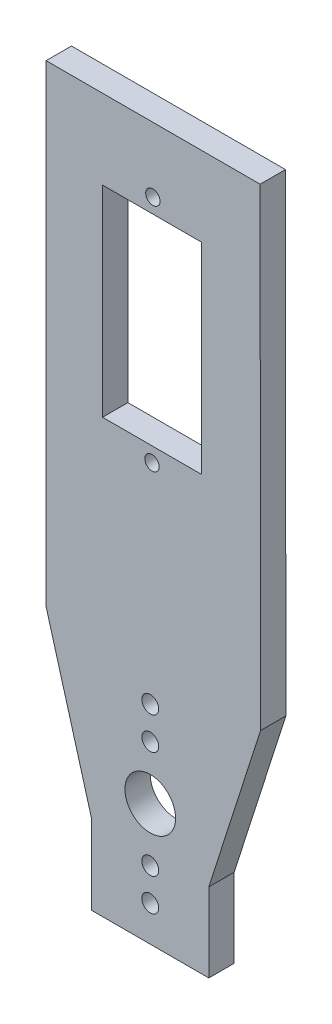
ISO-10303-21;
HEADER;
FILE_DESCRIPTION(('STEP AP214'),'2;1');
FILE_NAME('part.step','',(''),(''),'','','');
FILE_SCHEMA(('AUTOMOTIVE_DESIGN { 1 0 10303 214 1 1 1 1 }'));
ENDSEC;
DATA;
#1=APPLICATION_CONTEXT('core data for automotive mechanical design processes');
#2=APPLICATION_PROTOCOL_DEFINITION('international standard','automotive_design',2000,#1);
#3=PRODUCT_CONTEXT('',#1,'mechanical');
#4=PRODUCT('Part','Part','',(#3));
#5=PRODUCT_RELATED_PRODUCT_CATEGORY('part','',(#4));
#6=PRODUCT_DEFINITION_FORMATION('','',#4);
#7=PRODUCT_DEFINITION_CONTEXT('part definition',#1,'design');
#8=PRODUCT_DEFINITION('design','',#6,#7);
#9=PRODUCT_DEFINITION_SHAPE('','',#8);
#10=(LENGTH_UNIT() NAMED_UNIT(*) SI_UNIT(.MILLI.,.METRE.));
#11=(NAMED_UNIT(*) PLANE_ANGLE_UNIT() SI_UNIT($,.RADIAN.));
#12=(NAMED_UNIT(*) SI_UNIT($,.STERADIAN.) SOLID_ANGLE_UNIT());
#13=UNCERTAINTY_MEASURE_WITH_UNIT(LENGTH_MEASURE(1.E-05),#10,'distance_accuracy_value','');
#14=(GEOMETRIC_REPRESENTATION_CONTEXT(3) GLOBAL_UNCERTAINTY_ASSIGNED_CONTEXT((#13)) GLOBAL_UNIT_ASSIGNED_CONTEXT((#10,
#11,#12)) REPRESENTATION_CONTEXT('',''));
#15=CARTESIAN_POINT('',(0.,0.,0.));
#16=DIRECTION('',(0.,0.,1.));
#17=DIRECTION('',(1.,0.,0.));
#18=AXIS2_PLACEMENT_3D('',#15,#16,#17);
#19=CARTESIAN_POINT('',(0.,0.,3.));
#20=DIRECTION('',(0.,0.,1.));
#21=DIRECTION('',(1.,0.,0.));
#22=AXIS2_PLACEMENT_3D('',#19,#20,#21);
#23=PLANE('',#22);
#24=CARTESIAN_POINT('',(-356.8563,191.755994220096,3.));
#25=DIRECTION('',(0.,0.,1.));
#26=DIRECTION('',(1.,0.,0.));
#27=AXIS2_PLACEMENT_3D('',#24,#25,#26);
#28=CIRCLE('',#27,1.00090000000003);
#29=CARTESIAN_POINT('',(-355.8554,191.755994220096,3.));
#30=VERTEX_POINT('',#29);
#31=EDGE_CURVE('E336',#30,#30,#28,.T.);
#32=ORIENTED_EDGE('',*,*,#31,.F.);
#33=EDGE_LOOP('',(#32));
#34=FACE_BOUND('',#33,.T.);
#35=CARTESIAN_POINT('',(-356.8563,187.905994220096,3.));
#36=DIRECTION('',(0.,0.,1.));
#37=DIRECTION('',(1.,0.,0.));
#38=AXIS2_PLACEMENT_3D('',#35,#36,#37);
#39=CIRCLE('',#38,1.00090000000003);
#40=CARTESIAN_POINT('',(-355.8554,187.905994220096,3.));
#41=VERTEX_POINT('',#40);
#42=EDGE_CURVE('E338',#41,#41,#39,.T.);
#43=ORIENTED_EDGE('',*,*,#42,.F.);
#44=EDGE_LOOP('',(#43));
#45=FACE_BOUND('',#44,.T.);
#46=CARTESIAN_POINT('',(-356.8563,175.205994220096,3.));
#47=DIRECTION('',(0.,0.,1.));
#48=DIRECTION('',(1.,0.,0.));
#49=AXIS2_PLACEMENT_3D('',#46,#47,#48);
#50=CIRCLE('',#49,1.00090000000003);
#51=CARTESIAN_POINT('',(-355.8554,175.205994220096,3.));
#52=VERTEX_POINT('',#51);
#53=EDGE_CURVE('E344',#52,#52,#50,.T.);
#54=ORIENTED_EDGE('',*,*,#53,.F.);
#55=EDGE_LOOP('',(#54));
#56=FACE_BOUND('',#55,.T.);
#57=CARTESIAN_POINT('',(-356.8563,171.355994220096,3.));
#58=DIRECTION('',(0.,0.,1.));
#59=DIRECTION('',(1.,0.,0.));
#60=AXIS2_PLACEMENT_3D('',#57,#58,#59);
#61=CIRCLE('',#60,1.00090000000003);
#62=CARTESIAN_POINT('',(-355.8554,171.355994220096,3.));
#63=VERTEX_POINT('',#62);
#64=EDGE_CURVE('E350',#63,#63,#61,.T.);
#65=ORIENTED_EDGE('',*,*,#64,.F.);
#66=EDGE_LOOP('',(#65));
#67=FACE_BOUND('',#66,.T.);
#68=CARTESIAN_POINT('',(-356.653301566627,216.604309820037,3.));
#69=DIRECTION('',(0.,0.,1.));
#70=DIRECTION('',(1.,0.,0.));
#71=AXIS2_PLACEMENT_3D('',#68,#69,#70);
#72=CIRCLE('',#71,0.850000000000038);
#73=CARTESIAN_POINT('',(-355.803301566627,216.604309820037,3.));
#74=VERTEX_POINT('',#73);
#75=EDGE_CURVE('E151',#74,#74,#72,.T.);
#76=ORIENTED_EDGE('',*,*,#75,.F.);
#77=EDGE_LOOP('',(#76));
#78=FACE_BOUND('',#77,.T.);
#79=CARTESIAN_POINT('',(-356.8563,181.555994220096,3.));
#80=DIRECTION('',(0.,0.,1.));
#81=DIRECTION('',(1.,0.,0.));
#82=AXIS2_PLACEMENT_3D('',#79,#80,#81);
#83=CIRCLE('',#82,2.99999999999999);
#84=CARTESIAN_POINT('',(-353.8563,181.555994220096,3.));
#85=VERTEX_POINT('',#84);
#86=EDGE_CURVE('E161',#85,#85,#83,.T.);
#87=ORIENTED_EDGE('',*,*,#86,.F.);
#88=EDGE_LOOP('',(#87));
#89=FACE_BOUND('',#88,.T.);
#90=DIRECTION('',(0.,-1.,0.));
#91=VECTOR('',#90,1.);
#92=CARTESIAN_POINT('',(-363.784573437846,176.492478394456,3.));
#93=LINE('',#92,#91);
#94=CARTESIAN_POINT('',(-363.784573437846,176.492478394456,3.));
#95=VERTEX_POINT('',#94);
#96=CARTESIAN_POINT('',(-363.784573437846,167.153932289193,3.));
#97=VERTEX_POINT('',#96);
#98=EDGE_CURVE('E167',#95,#97,#93,.T.);
#99=ORIENTED_EDGE('',*,*,#98,.T.);
#100=DIRECTION('',(1.,0.,0.));
#101=VECTOR('',#100,1.);
#102=CARTESIAN_POINT('',(-363.784573437846,167.153932289193,3.));
#103=LINE('',#102,#101);
#104=CARTESIAN_POINT('',(-349.928026562154,167.153932289193,3.));
#105=VERTEX_POINT('',#104);
#106=EDGE_CURVE('E170',#97,#105,#103,.T.);
#107=ORIENTED_EDGE('',*,*,#106,.T.);
#108=DIRECTION('',(0.,1.,0.));
#109=VECTOR('',#108,1.);
#110=CARTESIAN_POINT('',(-349.928026562154,176.492478394456,3.));
#111=LINE('',#110,#109);
#112=CARTESIAN_POINT('',(-349.928026562154,176.492478394456,3.));
#113=VERTEX_POINT('',#112);
#114=EDGE_CURVE('E173',#105,#113,#111,.T.);
#115=ORIENTED_EDGE('',*,*,#114,.T.);
#116=DIRECTION('',(0.305443848239875,0.952210090039176,0.));
#117=VECTOR('',#116,1.);
#118=CARTESIAN_POINT('',(-343.806464443043,195.57622570254,3.));
#119=LINE('',#118,#117);
#120=CARTESIAN_POINT('',(-343.806464443043,195.57622570254,3.));
#121=VERTEX_POINT('',#120);
#122=EDGE_CURVE('E175',#113,#121,#119,.T.);
#123=ORIENTED_EDGE('',*,*,#122,.T.);
#124=DIRECTION('',(-0.000844338589061444,0.99999964354611,0.));
#125=VECTOR('',#124,1.);
#126=CARTESIAN_POINT('',(-343.853730338658,251.555994220096,3.));
#127=LINE('',#126,#125);
#128=CARTESIAN_POINT('',(-343.853730338658,251.555994220096,3.));
#129=VERTEX_POINT('',#128);
#130=EDGE_CURVE('E177',#121,#129,#127,.T.);
#131=ORIENTED_EDGE('',*,*,#130,.T.);
#132=DIRECTION('',(-1.,0.,0.));
#133=VECTOR('',#132,1.);
#134=CARTESIAN_POINT('',(-369.180567886487,251.555994220096,3.));
#135=LINE('',#134,#133);
#136=CARTESIAN_POINT('',(-369.180567886487,251.555994220096,3.));
#137=VERTEX_POINT('',#136);
#138=EDGE_CURVE('E179',#129,#137,#135,.T.);
#139=ORIENTED_EDGE('',*,*,#138,.T.);
#140=DIRECTION('',(0.,-1.,0.));
#141=VECTOR('',#140,1.);
#142=CARTESIAN_POINT('',(-369.180567886487,195.57622570254,3.));
#143=LINE('',#142,#141);
#144=CARTESIAN_POINT('',(-369.180567886487,195.57622570254,3.));
#145=VERTEX_POINT('',#144);
#146=EDGE_CURVE('E181',#137,#145,#143,.T.);
#147=ORIENTED_EDGE('',*,*,#146,.T.);
#148=DIRECTION('',(0.272085949798576,-0.962272952920431,0.));
#149=VECTOR('',#148,1.);
#150=CARTESIAN_POINT('',(-363.784573437846,176.492478394456,3.));
#151=LINE('',#150,#149);
#152=EDGE_CURVE('E183',#145,#95,#151,.T.);
#153=ORIENTED_EDGE('',*,*,#152,.T.);
#154=EDGE_LOOP('',(#99,#107,#115,#123,#131,#139,#147,#153));
#155=FACE_BOUND('',#154,.T.);
#156=DIRECTION('',(1.,0.,0.));
#157=VECTOR('',#156,1.);
#158=CARTESIAN_POINT('',(-362.501230889206,218.342409820037,3.));
#159=LINE('',#158,#157);
#160=CARTESIAN_POINT('',(-362.501230889206,218.342409820037,3.));
#161=VERTEX_POINT('',#160);
#162=CARTESIAN_POINT('',(-350.791830889206,218.342409820037,3.));
#163=VERTEX_POINT('',#162);
#164=EDGE_CURVE('E130',#161,#163,#159,.T.);
#165=ORIENTED_EDGE('',*,*,#164,.F.);
#166=DIRECTION('',(0.,-1.,0.));
#167=VECTOR('',#166,1.);
#168=CARTESIAN_POINT('',(-362.501230889206,242.142209820037,3.));
#169=LINE('',#168,#167);
#170=CARTESIAN_POINT('',(-362.501230889206,242.142209820037,3.));
#171=VERTEX_POINT('',#170);
#172=EDGE_CURVE('E122',#171,#161,#169,.T.);
#173=ORIENTED_EDGE('',*,*,#172,.F.);
#174=DIRECTION('',(-1.,0.,0.));
#175=VECTOR('',#174,1.);
#176=CARTESIAN_POINT('',(-362.501230889206,242.142209820037,3.));
#177=LINE('',#176,#175);
#178=CARTESIAN_POINT('',(-350.791830889206,242.142209820037,3.));
#179=VERTEX_POINT('',#178);
#180=EDGE_CURVE('E145',#179,#171,#177,.T.);
#181=ORIENTED_EDGE('',*,*,#180,.F.);
#182=DIRECTION('',(0.,1.,0.));
#183=VECTOR('',#182,1.);
#184=CARTESIAN_POINT('',(-350.791830889206,242.142209820037,3.));
#185=LINE('',#184,#183);
#186=EDGE_CURVE('E143',#163,#179,#185,.T.);
#187=ORIENTED_EDGE('',*,*,#186,.F.);
#188=EDGE_LOOP('',(#165,#173,#181,#187));
#189=FACE_BOUND('',#188,.T.);
#190=CARTESIAN_POINT('',(-356.547049338715,243.880309820037,3.));
#191=DIRECTION('',(0.,0.,1.));
#192=DIRECTION('',(1.,0.,0.));
#193=AXIS2_PLACEMENT_3D('',#190,#191,#192);
#194=CIRCLE('',#193,0.850000000000038);
#195=CARTESIAN_POINT('',(-355.697049338715,243.880309820037,3.));
#196=VERTEX_POINT('',#195);
#197=EDGE_CURVE('E359',#196,#196,#194,.T.);
#198=ORIENTED_EDGE('',*,*,#197,.F.);
#199=EDGE_LOOP('',(#198));
#200=FACE_BOUND('',#199,.T.);
#201=ADVANCED_FACE('F33',(#34,#45,#56,#67,#78,#89,#155,#189,#200),#23,.T.);
#202=CARTESIAN_POINT('',(0.,0.,0.));
#203=DIRECTION('',(0.,0.,1.));
#204=DIRECTION('',(1.,0.,0.));
#205=AXIS2_PLACEMENT_3D('',#202,#203,#204);
#206=PLANE('',#205);
#207=CARTESIAN_POINT('',(-356.8563,191.755994220096,0.));
#208=DIRECTION('',(0.,0.,1.));
#209=DIRECTION('',(1.,0.,0.));
#210=AXIS2_PLACEMENT_3D('',#207,#208,#209);
#211=CIRCLE('',#210,1.00090000000003);
#212=CARTESIAN_POINT('',(-355.8554,191.755994220096,0.));
#213=VERTEX_POINT('',#212);
#214=EDGE_CURVE('E334',#213,#213,#211,.T.);
#215=ORIENTED_EDGE('',*,*,#214,.T.);
#216=EDGE_LOOP('',(#215));
#217=FACE_BOUND('',#216,.T.);
#218=CARTESIAN_POINT('',(-356.8563,187.905994220096,0.));
#219=DIRECTION('',(0.,0.,1.));
#220=DIRECTION('',(1.,0.,0.));
#221=AXIS2_PLACEMENT_3D('',#218,#219,#220);
#222=CIRCLE('',#221,1.00090000000003);
#223=CARTESIAN_POINT('',(-355.8554,187.905994220096,0.));
#224=VERTEX_POINT('',#223);
#225=EDGE_CURVE('E341',#224,#224,#222,.T.);
#226=ORIENTED_EDGE('',*,*,#225,.T.);
#227=EDGE_LOOP('',(#226));
#228=FACE_BOUND('',#227,.T.);
#229=CARTESIAN_POINT('',(-356.8563,175.205994220096,0.));
#230=DIRECTION('',(0.,0.,1.));
#231=DIRECTION('',(1.,0.,0.));
#232=AXIS2_PLACEMENT_3D('',#229,#230,#231);
#233=CIRCLE('',#232,1.00090000000003);
#234=CARTESIAN_POINT('',(-355.8554,175.205994220096,0.));
#235=VERTEX_POINT('',#234);
#236=EDGE_CURVE('E347',#235,#235,#233,.T.);
#237=ORIENTED_EDGE('',*,*,#236,.T.);
#238=EDGE_LOOP('',(#237));
#239=FACE_BOUND('',#238,.T.);
#240=CARTESIAN_POINT('',(-356.8563,171.355994220096,0.));
#241=DIRECTION('',(0.,0.,1.));
#242=DIRECTION('',(1.,0.,0.));
#243=AXIS2_PLACEMENT_3D('',#240,#241,#242);
#244=CIRCLE('',#243,1.00090000000003);
#245=CARTESIAN_POINT('',(-355.8554,171.355994220096,0.));
#246=VERTEX_POINT('',#245);
#247=EDGE_CURVE('E353',#246,#246,#244,.T.);
#248=ORIENTED_EDGE('',*,*,#247,.T.);
#249=EDGE_LOOP('',(#248));
#250=FACE_BOUND('',#249,.T.);
#251=CARTESIAN_POINT('',(-356.653301566627,216.604309820037,0.));
#252=DIRECTION('',(0.,0.,1.));
#253=DIRECTION('',(1.,0.,0.));
#254=AXIS2_PLACEMENT_3D('',#251,#252,#253);
#255=CIRCLE('',#254,0.850000000000038);
#256=CARTESIAN_POINT('',(-355.803301566627,216.604309820037,0.));
#257=VERTEX_POINT('',#256);
#258=EDGE_CURVE('E362',#257,#257,#255,.T.);
#259=ORIENTED_EDGE('',*,*,#258,.T.);
#260=EDGE_LOOP('',(#259));
#261=FACE_BOUND('',#260,.T.);
#262=CARTESIAN_POINT('',(-356.8563,181.555994220096,0.));
#263=DIRECTION('',(0.,0.,1.));
#264=DIRECTION('',(1.,0.,0.));
#265=AXIS2_PLACEMENT_3D('',#262,#263,#264);
#266=CIRCLE('',#265,2.99999999999999);
#267=CARTESIAN_POINT('',(-353.8563,181.555994220096,0.));
#268=VERTEX_POINT('',#267);
#269=EDGE_CURVE('E138',#268,#268,#266,.T.);
#270=ORIENTED_EDGE('',*,*,#269,.T.);
#271=EDGE_LOOP('',(#270));
#272=FACE_BOUND('',#271,.T.);
#273=DIRECTION('',(0.,-1.,0.));
#274=VECTOR('',#273,1.);
#275=CARTESIAN_POINT('',(-363.784573437846,176.492478394456,0.));
#276=LINE('',#275,#274);
#277=CARTESIAN_POINT('',(-363.784573437846,176.492478394456,0.));
#278=VERTEX_POINT('',#277);
#279=CARTESIAN_POINT('',(-363.784573437846,167.153932289193,0.));
#280=VERTEX_POINT('',#279);
#281=EDGE_CURVE('E164',#278,#280,#276,.T.);
#282=ORIENTED_EDGE('',*,*,#281,.F.);
#283=DIRECTION('',(0.272085949798576,-0.962272952920431,0.));
#284=VECTOR('',#283,1.);
#285=CARTESIAN_POINT('',(-363.784573437846,176.492478394456,0.));
#286=LINE('',#285,#284);
#287=CARTESIAN_POINT('',(-369.180567886487,195.57622570254,0.));
#288=VERTEX_POINT('',#287);
#289=EDGE_CURVE('E171',#288,#278,#286,.T.);
#290=ORIENTED_EDGE('',*,*,#289,.F.);
#291=DIRECTION('',(0.,-1.,0.));
#292=VECTOR('',#291,1.);
#293=CARTESIAN_POINT('',(-369.180567886487,195.57622570254,0.));
#294=LINE('',#293,#292);
#295=CARTESIAN_POINT('',(-369.180567886487,251.555994220096,0.));
#296=VERTEX_POINT('',#295);
#297=EDGE_CURVE('E198',#296,#288,#294,.T.);
#298=ORIENTED_EDGE('',*,*,#297,.F.);
#299=DIRECTION('',(-1.,0.,0.));
#300=VECTOR('',#299,1.);
#301=CARTESIAN_POINT('',(-369.180567886487,251.555994220096,0.));
#302=LINE('',#301,#300);
#303=CARTESIAN_POINT('',(-343.853730338658,251.555994220096,0.));
#304=VERTEX_POINT('',#303);
#305=EDGE_CURVE('E196',#304,#296,#302,.T.);
#306=ORIENTED_EDGE('',*,*,#305,.F.);
#307=DIRECTION('',(-0.000844338589061444,0.99999964354611,0.));
#308=VECTOR('',#307,1.);
#309=CARTESIAN_POINT('',(-343.853730338658,251.555994220096,0.));
#310=LINE('',#309,#308);
#311=CARTESIAN_POINT('',(-343.806464443043,195.57622570254,0.));
#312=VERTEX_POINT('',#311);
#313=EDGE_CURVE('E194',#312,#304,#310,.T.);
#314=ORIENTED_EDGE('',*,*,#313,.F.);
#315=DIRECTION('',(0.305443848239875,0.952210090039176,0.));
#316=VECTOR('',#315,1.);
#317=CARTESIAN_POINT('',(-343.806464443043,195.57622570254,0.));
#318=LINE('',#317,#316);
#319=CARTESIAN_POINT('',(-349.928026562154,176.492478394456,0.));
#320=VERTEX_POINT('',#319);
#321=EDGE_CURVE('E192',#320,#312,#318,.T.);
#322=ORIENTED_EDGE('',*,*,#321,.F.);
#323=DIRECTION('',(0.,1.,0.));
#324=VECTOR('',#323,1.);
#325=CARTESIAN_POINT('',(-349.928026562154,176.492478394456,0.));
#326=LINE('',#325,#324);
#327=CARTESIAN_POINT('',(-349.928026562154,167.153932289193,0.));
#328=VERTEX_POINT('',#327);
#329=EDGE_CURVE('E190',#328,#320,#326,.T.);
#330=ORIENTED_EDGE('',*,*,#329,.F.);
#331=DIRECTION('',(1.,0.,0.));
#332=VECTOR('',#331,1.);
#333=CARTESIAN_POINT('',(-363.784573437846,167.153932289193,0.));
#334=LINE('',#333,#332);
#335=EDGE_CURVE('E188',#280,#328,#334,.T.);
#336=ORIENTED_EDGE('',*,*,#335,.F.);
#337=EDGE_LOOP('',(#282,#290,#298,#306,#314,#322,#330,#336));
#338=FACE_BOUND('',#337,.T.);
#339=DIRECTION('',(0.,-1.,0.));
#340=VECTOR('',#339,1.);
#341=CARTESIAN_POINT('',(-362.501230889206,242.142209820037,0.));
#342=LINE('',#341,#340);
#343=CARTESIAN_POINT('',(-362.501230889206,242.142209820037,0.));
#344=VERTEX_POINT('',#343);
#345=CARTESIAN_POINT('',(-362.501230889206,218.342409820037,0.));
#346=VERTEX_POINT('',#345);
#347=EDGE_CURVE('E56',#344,#346,#342,.T.);
#348=ORIENTED_EDGE('',*,*,#347,.T.);
#349=DIRECTION('',(1.,0.,0.));
#350=VECTOR('',#349,1.);
#351=CARTESIAN_POINT('',(-362.501230889206,218.342409820037,0.));
#352=LINE('',#351,#350);
#353=CARTESIAN_POINT('',(-350.791830889206,218.342409820037,0.));
#354=VERTEX_POINT('',#353);
#355=EDGE_CURVE('E137',#346,#354,#352,.T.);
#356=ORIENTED_EDGE('',*,*,#355,.T.);
#357=DIRECTION('',(0.,1.,0.));
#358=VECTOR('',#357,1.);
#359=CARTESIAN_POINT('',(-350.791830889206,242.142209820037,0.));
#360=LINE('',#359,#358);
#361=CARTESIAN_POINT('',(-350.791830889206,242.142209820037,0.));
#362=VERTEX_POINT('',#361);
#363=EDGE_CURVE('E153',#354,#362,#360,.T.);
#364=ORIENTED_EDGE('',*,*,#363,.T.);
#365=DIRECTION('',(-1.,0.,0.));
#366=VECTOR('',#365,1.);
#367=CARTESIAN_POINT('',(-362.501230889206,242.142209820037,0.));
#368=LINE('',#367,#366);
#369=EDGE_CURVE('E131',#362,#344,#368,.T.);
#370=ORIENTED_EDGE('',*,*,#369,.T.);
#371=EDGE_LOOP('',(#348,#356,#364,#370));
#372=FACE_BOUND('',#371,.T.);
#373=CARTESIAN_POINT('',(-356.547049338715,243.880309820037,0.));
#374=DIRECTION('',(0.,0.,1.));
#375=DIRECTION('',(1.,0.,0.));
#376=AXIS2_PLACEMENT_3D('',#373,#374,#375);
#377=CIRCLE('',#376,0.850000000000038);
#378=CARTESIAN_POINT('',(-355.697049338715,243.880309820037,0.));
#379=VERTEX_POINT('',#378);
#380=EDGE_CURVE('E356',#379,#379,#377,.T.);
#381=ORIENTED_EDGE('',*,*,#380,.T.);
#382=EDGE_LOOP('',(#381));
#383=FACE_BOUND('',#382,.T.);
#384=ADVANCED_FACE('F228',(#217,#228,#239,#250,#261,#272,#338,#372,#383),#206,.F.);
#385=CARTESIAN_POINT('',(-363.784573437846,176.492478394456,3.));
#386=DIRECTION('',(1.,0.,0.));
#387=DIRECTION('',(0.,0.,-1.));
#388=AXIS2_PLACEMENT_3D('',#385,#386,#387);
#389=PLANE('',#388);
#390=ORIENTED_EDGE('',*,*,#281,.T.);
#391=DIRECTION('',(0.,0.,-1.));
#392=VECTOR('',#391,1.);
#393=CARTESIAN_POINT('',(-363.784573437846,167.153932289193,3.));
#394=LINE('',#393,#392);
#395=EDGE_CURVE('E11',#97,#280,#394,.T.);
#396=ORIENTED_EDGE('',*,*,#395,.F.);
#397=ORIENTED_EDGE('',*,*,#98,.F.);
#398=DIRECTION('',(0.,0.,-1.));
#399=VECTOR('',#398,1.);
#400=CARTESIAN_POINT('',(-363.784573437846,176.492478394456,3.));
#401=LINE('',#400,#399);
#402=EDGE_CURVE('E185',#95,#278,#401,.T.);
#403=ORIENTED_EDGE('',*,*,#402,.T.);
#404=EDGE_LOOP('',(#390,#396,#397,#403));
#405=FACE_BOUND('',#404,.T.);
#406=ADVANCED_FACE('F35',(#405),#389,.F.);
#407=CARTESIAN_POINT('',(-363.784573437846,167.153932289193,3.));
#408=DIRECTION('',(0.,1.,0.));
#409=DIRECTION('',(0.,0.,1.));
#410=AXIS2_PLACEMENT_3D('',#407,#408,#409);
#411=PLANE('',#410);
#412=ORIENTED_EDGE('',*,*,#335,.T.);
#413=DIRECTION('',(0.,0.,-1.));
#414=VECTOR('',#413,1.);
#415=CARTESIAN_POINT('',(-349.928026562154,167.153932289193,3.));
#416=LINE('',#415,#414);
#417=EDGE_CURVE('E41',#105,#328,#416,.T.);
#418=ORIENTED_EDGE('',*,*,#417,.F.);
#419=ORIENTED_EDGE('',*,*,#106,.F.);
#420=ORIENTED_EDGE('',*,*,#395,.T.);
#421=EDGE_LOOP('',(#412,#418,#419,#420));
#422=FACE_BOUND('',#421,.T.);
#423=ADVANCED_FACE('F245',(#422),#411,.F.);
#424=CARTESIAN_POINT('',(-349.928026562154,176.492478394456,3.));
#425=DIRECTION('',(-1.,0.,0.));
#426=DIRECTION('',(0.,0.,1.));
#427=AXIS2_PLACEMENT_3D('',#424,#425,#426);
#428=PLANE('',#427);
#429=ORIENTED_EDGE('',*,*,#329,.T.);
#430=DIRECTION('',(0.,0.,-1.));
#431=VECTOR('',#430,1.);
#432=CARTESIAN_POINT('',(-349.928026562154,176.492478394456,3.));
#433=LINE('',#432,#431);
#434=EDGE_CURVE('E215',#113,#320,#433,.T.);
#435=ORIENTED_EDGE('',*,*,#434,.F.);
#436=ORIENTED_EDGE('',*,*,#114,.F.);
#437=ORIENTED_EDGE('',*,*,#417,.T.);
#438=EDGE_LOOP('',(#429,#435,#436,#437));
#439=FACE_BOUND('',#438,.T.);
#440=ADVANCED_FACE('F222',(#439),#428,.F.);
#441=CARTESIAN_POINT('',(-343.806464443043,195.57622570254,3.));
#442=DIRECTION('',(-0.952210090039176,0.305443848239875,0.));
#443=DIRECTION('',(-0.305443848239875,-0.952210090039176,0.));
#444=AXIS2_PLACEMENT_3D('',#441,#442,#443);
#445=PLANE('',#444);
#446=ORIENTED_EDGE('',*,*,#321,.T.);
#447=DIRECTION('',(0.,0.,-1.));
#448=VECTOR('',#447,1.);
#449=CARTESIAN_POINT('',(-343.806464443043,195.57622570254,3.));
#450=LINE('',#449,#448);
#451=EDGE_CURVE('E212',#121,#312,#450,.T.);
#452=ORIENTED_EDGE('',*,*,#451,.F.);
#453=ORIENTED_EDGE('',*,*,#122,.F.);
#454=ORIENTED_EDGE('',*,*,#434,.T.);
#455=EDGE_LOOP('',(#446,#452,#453,#454));
#456=FACE_BOUND('',#455,.T.);
#457=ADVANCED_FACE('F234',(#456),#445,.F.);
#458=CARTESIAN_POINT('',(-343.853730338658,251.555994220096,3.));
#459=DIRECTION('',(-0.99999964354611,-0.000844338589061444,0.));
#460=DIRECTION('',(0.000844338589061444,-0.99999964354611,0.));
#461=AXIS2_PLACEMENT_3D('',#458,#459,#460);
#462=PLANE('',#461);
#463=ORIENTED_EDGE('',*,*,#313,.T.);
#464=DIRECTION('',(0.,0.,-1.));
#465=VECTOR('',#464,1.);
#466=CARTESIAN_POINT('',(-343.853730338658,251.555994220096,3.));
#467=LINE('',#466,#465);
#468=EDGE_CURVE('E209',#129,#304,#467,.T.);
#469=ORIENTED_EDGE('',*,*,#468,.F.);
#470=ORIENTED_EDGE('',*,*,#130,.F.);
#471=ORIENTED_EDGE('',*,*,#451,.T.);
#472=EDGE_LOOP('',(#463,#469,#470,#471));
#473=FACE_BOUND('',#472,.T.);
#474=ADVANCED_FACE('F238',(#473),#462,.F.);
#475=CARTESIAN_POINT('',(-369.180567886487,251.555994220096,3.));
#476=DIRECTION('',(0.,-1.,0.));
#477=DIRECTION('',(0.,0.,-1.));
#478=AXIS2_PLACEMENT_3D('',#475,#476,#477);
#479=PLANE('',#478);
#480=ORIENTED_EDGE('',*,*,#305,.T.);
#481=DIRECTION('',(0.,0.,-1.));
#482=VECTOR('',#481,1.);
#483=CARTESIAN_POINT('',(-369.180567886487,251.555994220096,3.));
#484=LINE('',#483,#482);
#485=EDGE_CURVE('E206',#137,#296,#484,.T.);
#486=ORIENTED_EDGE('',*,*,#485,.F.);
#487=ORIENTED_EDGE('',*,*,#138,.F.);
#488=ORIENTED_EDGE('',*,*,#468,.T.);
#489=EDGE_LOOP('',(#480,#486,#487,#488));
#490=FACE_BOUND('',#489,.T.);
#491=ADVANCED_FACE('F258',(#490),#479,.F.);
#492=CARTESIAN_POINT('',(-369.180567886487,195.57622570254,3.));
#493=DIRECTION('',(1.,0.,0.));
#494=DIRECTION('',(0.,0.,-1.));
#495=AXIS2_PLACEMENT_3D('',#492,#493,#494);
#496=PLANE('',#495);
#497=ORIENTED_EDGE('',*,*,#297,.T.);
#498=DIRECTION('',(0.,0.,-1.));
#499=VECTOR('',#498,1.);
#500=CARTESIAN_POINT('',(-369.180567886487,195.57622570254,3.));
#501=LINE('',#500,#499);
#502=EDGE_CURVE('E203',#145,#288,#501,.T.);
#503=ORIENTED_EDGE('',*,*,#502,.F.);
#504=ORIENTED_EDGE('',*,*,#146,.F.);
#505=ORIENTED_EDGE('',*,*,#485,.T.);
#506=EDGE_LOOP('',(#497,#503,#504,#505));
#507=FACE_BOUND('',#506,.T.);
#508=ADVANCED_FACE('F256',(#507),#496,.F.);
#509=CARTESIAN_POINT('',(-363.784573437846,176.492478394456,3.));
#510=DIRECTION('',(0.962272952920431,0.272085949798576,0.));
#511=DIRECTION('',(-0.272085949798576,0.962272952920431,0.));
#512=AXIS2_PLACEMENT_3D('',#509,#510,#511);
#513=PLANE('',#512);
#514=ORIENTED_EDGE('',*,*,#289,.T.);
#515=ORIENTED_EDGE('',*,*,#402,.F.);
#516=ORIENTED_EDGE('',*,*,#152,.F.);
#517=ORIENTED_EDGE('',*,*,#502,.T.);
#518=EDGE_LOOP('',(#514,#515,#516,#517));
#519=FACE_BOUND('',#518,.T.);
#520=ADVANCED_FACE('F251',(#519),#513,.F.);
#521=CARTESIAN_POINT('',(-356.8563,181.555994220096,3.));
#522=DIRECTION('',(0.,0.,-1.));
#523=DIRECTION('',(-1.,0.,0.));
#524=AXIS2_PLACEMENT_3D('',#521,#522,#523);
#525=CYLINDRICAL_SURFACE('',#524,2.99999999999999);
#526=ORIENTED_EDGE('',*,*,#86,.T.);
#527=EDGE_LOOP('',(#526));
#528=FACE_BOUND('',#527,.T.);
#529=ORIENTED_EDGE('',*,*,#269,.F.);
#530=EDGE_LOOP('',(#529));
#531=FACE_BOUND('',#530,.T.);
#532=ADVANCED_FACE('F278',(#528,#531),#525,.F.);
#533=CARTESIAN_POINT('',(-362.501230889206,242.142209820037,3.));
#534=DIRECTION('',(1.,0.,0.));
#535=DIRECTION('',(0.,0.,-1.));
#536=AXIS2_PLACEMENT_3D('',#533,#534,#535);
#537=PLANE('',#536);
#538=ORIENTED_EDGE('',*,*,#347,.F.);
#539=DIRECTION('',(0.,0.,-1.));
#540=VECTOR('',#539,1.);
#541=CARTESIAN_POINT('',(-362.501230889206,242.142209820037,3.));
#542=LINE('',#541,#540);
#543=EDGE_CURVE('E126',#171,#344,#542,.T.);
#544=ORIENTED_EDGE('',*,*,#543,.F.);
#545=ORIENTED_EDGE('',*,*,#172,.T.);
#546=DIRECTION('',(0.,0.,-1.));
#547=VECTOR('',#546,1.);
#548=CARTESIAN_POINT('',(-362.501230889206,218.342409820037,3.));
#549=LINE('',#548,#547);
#550=EDGE_CURVE('E125',#161,#346,#549,.T.);
#551=ORIENTED_EDGE('',*,*,#550,.T.);
#552=EDGE_LOOP('',(#538,#544,#545,#551));
#553=FACE_BOUND('',#552,.T.);
#554=ADVANCED_FACE('F124',(#553),#537,.T.);
#555=CARTESIAN_POINT('',(-362.501230889206,218.342409820037,3.));
#556=DIRECTION('',(0.,1.,0.));
#557=DIRECTION('',(0.,0.,1.));
#558=AXIS2_PLACEMENT_3D('',#555,#556,#557);
#559=PLANE('',#558);
#560=ORIENTED_EDGE('',*,*,#355,.F.);
#561=ORIENTED_EDGE('',*,*,#550,.F.);
#562=ORIENTED_EDGE('',*,*,#164,.T.);
#563=DIRECTION('',(0.,0.,-1.));
#564=VECTOR('',#563,1.);
#565=CARTESIAN_POINT('',(-350.791830889206,218.342409820037,3.));
#566=LINE('',#565,#564);
#567=EDGE_CURVE('E139',#163,#354,#566,.T.);
#568=ORIENTED_EDGE('',*,*,#567,.T.);
#569=EDGE_LOOP('',(#560,#561,#562,#568));
#570=FACE_BOUND('',#569,.T.);
#571=ADVANCED_FACE('F134',(#570),#559,.T.);
#572=CARTESIAN_POINT('',(-350.791830889206,242.142209820037,3.));
#573=DIRECTION('',(-1.,0.,0.));
#574=DIRECTION('',(0.,0.,1.));
#575=AXIS2_PLACEMENT_3D('',#572,#573,#574);
#576=PLANE('',#575);
#577=ORIENTED_EDGE('',*,*,#363,.F.);
#578=ORIENTED_EDGE('',*,*,#567,.F.);
#579=ORIENTED_EDGE('',*,*,#186,.T.);
#580=DIRECTION('',(0.,0.,-1.));
#581=VECTOR('',#580,1.);
#582=CARTESIAN_POINT('',(-350.791830889206,242.142209820037,3.));
#583=LINE('',#582,#581);
#584=EDGE_CURVE('E48',#179,#362,#583,.T.);
#585=ORIENTED_EDGE('',*,*,#584,.T.);
#586=EDGE_LOOP('',(#577,#578,#579,#585));
#587=FACE_BOUND('',#586,.T.);
#588=ADVANCED_FACE('F297',(#587),#576,.T.);
#589=CARTESIAN_POINT('',(-362.501230889206,242.142209820037,3.));
#590=DIRECTION('',(0.,-1.,0.));
#591=DIRECTION('',(1.,0.,0.));
#592=AXIS2_PLACEMENT_3D('',#589,#590,#591);
#593=PLANE('',#592);
#594=ORIENTED_EDGE('',*,*,#369,.F.);
#595=ORIENTED_EDGE('',*,*,#584,.F.);
#596=ORIENTED_EDGE('',*,*,#180,.T.);
#597=ORIENTED_EDGE('',*,*,#543,.T.);
#598=EDGE_LOOP('',(#594,#595,#596,#597));
#599=FACE_BOUND('',#598,.T.);
#600=ADVANCED_FACE('F302',(#599),#593,.T.);
#601=CARTESIAN_POINT('',(-356.653301566627,216.604309820037,3.));
#602=DIRECTION('',(0.,0.,-1.));
#603=DIRECTION('',(-1.,0.,0.));
#604=AXIS2_PLACEMENT_3D('',#601,#602,#603);
#605=CYLINDRICAL_SURFACE('',#604,0.850000000000038);
#606=ORIENTED_EDGE('',*,*,#75,.T.);
#607=EDGE_LOOP('',(#606));
#608=FACE_BOUND('',#607,.T.);
#609=ORIENTED_EDGE('',*,*,#258,.F.);
#610=EDGE_LOOP('',(#609));
#611=FACE_BOUND('',#610,.T.);
#612=ADVANCED_FACE('F306',(#608,#611),#605,.F.);
#613=CARTESIAN_POINT('',(-356.547049338715,243.880309820037,3.));
#614=DIRECTION('',(0.,0.,-1.));
#615=DIRECTION('',(-1.,0.,0.));
#616=AXIS2_PLACEMENT_3D('',#613,#614,#615);
#617=CYLINDRICAL_SURFACE('',#616,0.850000000000038);
#618=ORIENTED_EDGE('',*,*,#197,.T.);
#619=EDGE_LOOP('',(#618));
#620=FACE_BOUND('',#619,.T.);
#621=ORIENTED_EDGE('',*,*,#380,.F.);
#622=EDGE_LOOP('',(#621));
#623=FACE_BOUND('',#622,.T.);
#624=ADVANCED_FACE('F309',(#620,#623),#617,.F.);
#625=CARTESIAN_POINT('',(-356.8563,171.355994220096,0.));
#626=DIRECTION('',(0.,0.,1.));
#627=DIRECTION('',(1.,0.,0.));
#628=AXIS2_PLACEMENT_3D('',#625,#626,#627);
#629=CYLINDRICAL_SURFACE('',#628,1.00090000000003);
#630=ORIENTED_EDGE('',*,*,#247,.F.);
#631=EDGE_LOOP('',(#630));
#632=FACE_BOUND('',#631,.T.);
#633=ORIENTED_EDGE('',*,*,#64,.T.);
#634=EDGE_LOOP('',(#633));
#635=FACE_BOUND('',#634,.T.);
#636=ADVANCED_FACE('F313',(#632,#635),#629,.F.);
#637=CARTESIAN_POINT('',(-356.8563,175.205994220096,0.));
#638=DIRECTION('',(0.,0.,1.));
#639=DIRECTION('',(1.,0.,0.));
#640=AXIS2_PLACEMENT_3D('',#637,#638,#639);
#641=CYLINDRICAL_SURFACE('',#640,1.00090000000003);
#642=ORIENTED_EDGE('',*,*,#236,.F.);
#643=EDGE_LOOP('',(#642));
#644=FACE_BOUND('',#643,.T.);
#645=ORIENTED_EDGE('',*,*,#53,.T.);
#646=EDGE_LOOP('',(#645));
#647=FACE_BOUND('',#646,.T.);
#648=ADVANCED_FACE('F317',(#644,#647),#641,.F.);
#649=CARTESIAN_POINT('',(-356.8563,187.905994220096,0.));
#650=DIRECTION('',(0.,0.,1.));
#651=DIRECTION('',(1.,0.,0.));
#652=AXIS2_PLACEMENT_3D('',#649,#650,#651);
#653=CYLINDRICAL_SURFACE('',#652,1.00090000000003);
#654=ORIENTED_EDGE('',*,*,#225,.F.);
#655=EDGE_LOOP('',(#654));
#656=FACE_BOUND('',#655,.T.);
#657=ORIENTED_EDGE('',*,*,#42,.T.);
#658=EDGE_LOOP('',(#657));
#659=FACE_BOUND('',#658,.T.);
#660=ADVANCED_FACE('F321',(#656,#659),#653,.F.);
#661=CARTESIAN_POINT('',(-356.8563,191.755994220096,0.));
#662=DIRECTION('',(0.,0.,1.));
#663=DIRECTION('',(1.,0.,0.));
#664=AXIS2_PLACEMENT_3D('',#661,#662,#663);
#665=CYLINDRICAL_SURFACE('',#664,1.00090000000003);
#666=ORIENTED_EDGE('',*,*,#214,.F.);
#667=EDGE_LOOP('',(#666));
#668=FACE_BOUND('',#667,.T.);
#669=ORIENTED_EDGE('',*,*,#31,.T.);
#670=EDGE_LOOP('',(#669));
#671=FACE_BOUND('',#670,.T.);
#672=ADVANCED_FACE('F325',(#668,#671),#665,.F.);
#673=CLOSED_SHELL('',(#201,#384,#406,#423,#440,#457,#474,#491,#508,#520,#532,#554,#571,#588,
#600,#612,#624,#636,#648,#660,#672));
#674=MANIFOLD_SOLID_BREP('B2',#673);
#675=ADVANCED_BREP_SHAPE_REPRESENTATION('',(#18,#674),#14);
#676=SHAPE_DEFINITION_REPRESENTATION(#9,#675);
ENDSEC;
END-ISO-10303-21;
